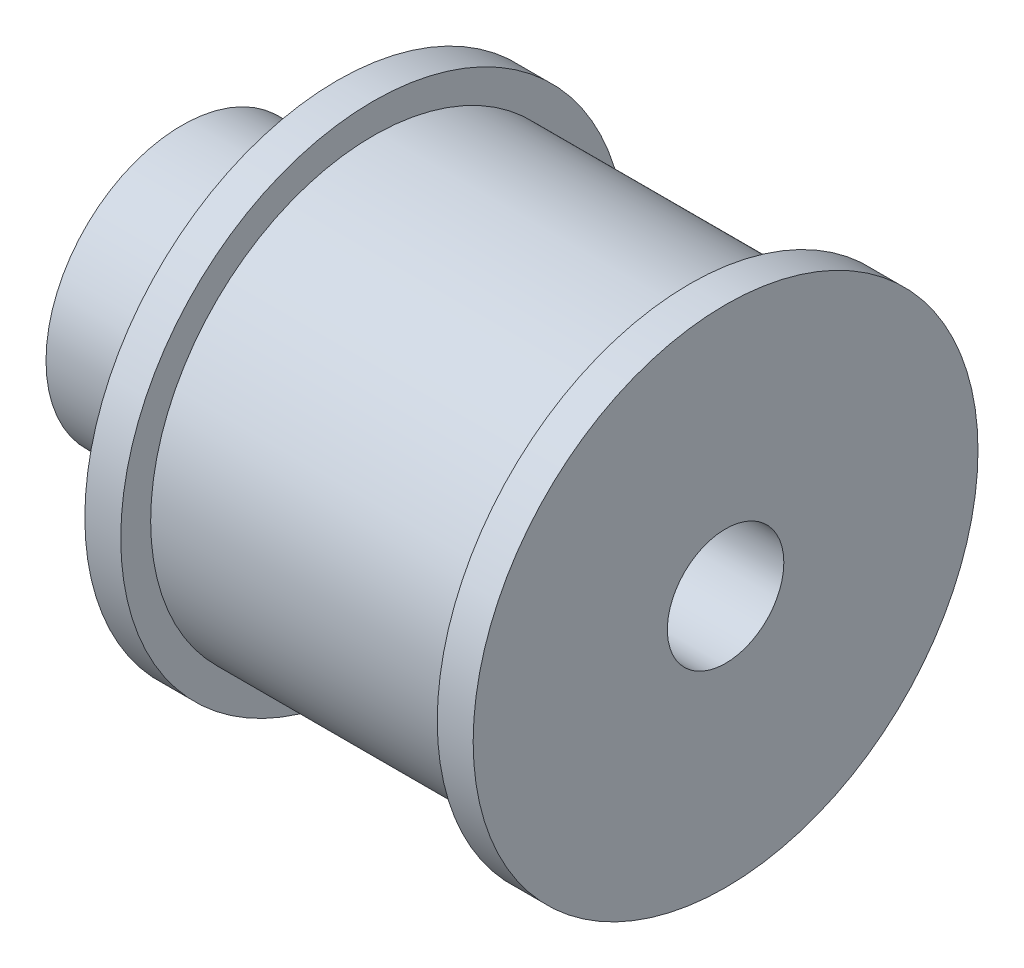
ISO-10303-21;
HEADER;
FILE_DESCRIPTION(('STEP AP214'),'2;1');
FILE_NAME('part.step','',(''),(''),'','','');
FILE_SCHEMA(('AUTOMOTIVE_DESIGN { 1 0 10303 214 1 1 1 1 }'));
ENDSEC;
DATA;
#1=APPLICATION_CONTEXT('core data for automotive mechanical design processes');
#2=APPLICATION_PROTOCOL_DEFINITION('international standard','automotive_design',2000,#1);
#3=PRODUCT_CONTEXT('',#1,'mechanical');
#4=PRODUCT('Part','Part','',(#3));
#5=PRODUCT_RELATED_PRODUCT_CATEGORY('part','',(#4));
#6=PRODUCT_DEFINITION_FORMATION('','',#4);
#7=PRODUCT_DEFINITION_CONTEXT('part definition',#1,'design');
#8=PRODUCT_DEFINITION('design','',#6,#7);
#9=PRODUCT_DEFINITION_SHAPE('','',#8);
#10=(LENGTH_UNIT() NAMED_UNIT(*) SI_UNIT(.MILLI.,.METRE.));
#11=(NAMED_UNIT(*) PLANE_ANGLE_UNIT() SI_UNIT($,.RADIAN.));
#12=(NAMED_UNIT(*) SI_UNIT($,.STERADIAN.) SOLID_ANGLE_UNIT());
#13=UNCERTAINTY_MEASURE_WITH_UNIT(LENGTH_MEASURE(1.E-05),#10,'distance_accuracy_value','');
#14=(GEOMETRIC_REPRESENTATION_CONTEXT(3) GLOBAL_UNCERTAINTY_ASSIGNED_CONTEXT((#13)) GLOBAL_UNIT_ASSIGNED_CONTEXT((#10,
#11,#12)) REPRESENTATION_CONTEXT('',''));
#15=CARTESIAN_POINT('',(0.,0.,0.));
#16=DIRECTION('',(0.,0.,1.));
#17=DIRECTION('',(1.,0.,0.));
#18=AXIS2_PLACEMENT_3D('',#15,#16,#17);
#19=CARTESIAN_POINT('',(-8.14999999999999,0.,11.46));
#20=DIRECTION('',(1.,0.,0.));
#21=DIRECTION('',(0.,0.,-1.));
#22=AXIS2_PLACEMENT_3D('',#19,#20,#21);
#23=PLANE('',#22);
#24=CARTESIAN_POINT('',(-8.14999999999999,0.,0.));
#25=DIRECTION('',(-1.,0.,0.));
#26=DIRECTION('',(0.,0.,1.));
#27=AXIS2_PLACEMENT_3D('',#24,#25,#26);
#28=CIRCLE('',#27,11.46);
#29=CARTESIAN_POINT('',(-8.14999999999999,0.,11.46));
#30=VERTEX_POINT('',#29);
#31=EDGE_CURVE('E52',#30,#30,#28,.T.);
#32=ORIENTED_EDGE('',*,*,#31,.T.);
#33=EDGE_LOOP('',(#32));
#34=FACE_BOUND('',#33,.T.);
#35=CARTESIAN_POINT('',(-8.14999999999999,0.,0.));
#36=DIRECTION('',(-1.,0.,0.));
#37=DIRECTION('',(0.,0.,1.));
#38=AXIS2_PLACEMENT_3D('',#35,#36,#37);
#39=CIRCLE('',#38,13.);
#40=CARTESIAN_POINT('',(-8.14999999999999,0.,13.));
#41=VERTEX_POINT('',#40);
#42=EDGE_CURVE('E11',#41,#41,#39,.T.);
#43=ORIENTED_EDGE('',*,*,#42,.F.);
#44=EDGE_LOOP('',(#43));
#45=FACE_BOUND('',#44,.T.);
#46=ADVANCED_FACE('F33',(#34,#45),#23,.T.);
#47=CARTESIAN_POINT('',(-10.,0.,0.));
#48=DIRECTION('',(-1.,0.,0.));
#49=DIRECTION('',(0.,0.,1.));
#50=AXIS2_PLACEMENT_3D('',#47,#48,#49);
#51=CYLINDRICAL_SURFACE('',#50,13.);
#52=ORIENTED_EDGE('',*,*,#42,.T.);
#53=EDGE_LOOP('',(#52));
#54=FACE_BOUND('',#53,.T.);
#55=CARTESIAN_POINT('',(-9.99999999999999,0.,0.));
#56=DIRECTION('',(-1.,0.,0.));
#57=DIRECTION('',(0.,0.,1.));
#58=AXIS2_PLACEMENT_3D('',#55,#56,#57);
#59=CIRCLE('',#58,13.);
#60=CARTESIAN_POINT('',(-9.99999999999999,0.,13.));
#61=VERTEX_POINT('',#60);
#62=EDGE_CURVE('E39',#61,#61,#59,.T.);
#63=ORIENTED_EDGE('',*,*,#62,.F.);
#64=EDGE_LOOP('',(#63));
#65=FACE_BOUND('',#64,.T.);
#66=ADVANCED_FACE('F80',(#54,#65),#51,.T.);
#67=CARTESIAN_POINT('',(-9.99999999999999,0.,13.));
#68=DIRECTION('',(-1.,0.,0.));
#69=DIRECTION('',(0.,0.,1.));
#70=AXIS2_PLACEMENT_3D('',#67,#68,#69);
#71=PLANE('',#70);
#72=ORIENTED_EDGE('',*,*,#62,.T.);
#73=EDGE_LOOP('',(#72));
#74=FACE_BOUND('',#73,.T.);
#75=CARTESIAN_POINT('',(-9.99999999999999,0.,0.));
#76=DIRECTION('',(-1.,0.,0.));
#77=DIRECTION('',(0.,0.,1.));
#78=AXIS2_PLACEMENT_3D('',#75,#76,#77);
#79=CIRCLE('',#78,7.);
#80=CARTESIAN_POINT('',(-9.99999999999999,0.,7.));
#81=VERTEX_POINT('',#80);
#82=EDGE_CURVE('E72',#81,#81,#79,.T.);
#83=ORIENTED_EDGE('',*,*,#82,.F.);
#84=EDGE_LOOP('',(#83));
#85=FACE_BOUND('',#84,.T.);
#86=ADVANCED_FACE('F77',(#74,#85),#71,.T.);
#87=CARTESIAN_POINT('',(-10.,0.,0.));
#88=DIRECTION('',(-1.,0.,0.));
#89=DIRECTION('',(0.,0.,1.));
#90=AXIS2_PLACEMENT_3D('',#87,#88,#89);
#91=CYLINDRICAL_SURFACE('',#90,7.);
#92=ORIENTED_EDGE('',*,*,#82,.T.);
#93=EDGE_LOOP('',(#92));
#94=FACE_BOUND('',#93,.T.);
#95=CARTESIAN_POINT('',(-18.,0.,0.));
#96=DIRECTION('',(-1.,0.,0.));
#97=DIRECTION('',(0.,0.,1.));
#98=AXIS2_PLACEMENT_3D('',#95,#96,#97);
#99=CIRCLE('',#98,7.);
#100=CARTESIAN_POINT('',(-18.,0.,7.));
#101=VERTEX_POINT('',#100);
#102=EDGE_CURVE('E69',#101,#101,#99,.T.);
#103=ORIENTED_EDGE('',*,*,#102,.F.);
#104=EDGE_LOOP('',(#103));
#105=FACE_BOUND('',#104,.T.);
#106=ADVANCED_FACE('F87',(#94,#105),#91,.T.);
#107=CARTESIAN_POINT('',(-18.,0.,0.));
#108=DIRECTION('',(-1.,0.,0.));
#109=DIRECTION('',(0.,0.,1.));
#110=AXIS2_PLACEMENT_3D('',#107,#108,#109);
#111=PLANE('',#110);
#112=ORIENTED_EDGE('',*,*,#102,.T.);
#113=EDGE_LOOP('',(#112));
#114=FACE_BOUND('',#113,.T.);
#115=ADVANCED_FACE('F93',(#114),#111,.T.);
#116=CARTESIAN_POINT('',(10.,0.,0.));
#117=DIRECTION('',(1.,0.,0.));
#118=DIRECTION('',(0.,0.,-1.));
#119=AXIS2_PLACEMENT_3D('',#116,#117,#118);
#120=PLANE('',#119);
#121=CARTESIAN_POINT('',(10.,0.,0.));
#122=DIRECTION('',(1.,0.,0.));
#123=DIRECTION('',(0.,0.,-1.));
#124=AXIS2_PLACEMENT_3D('',#121,#122,#123);
#125=CIRCLE('',#124,2.99999999999999);
#126=CARTESIAN_POINT('',(10.,0.,-2.99999999999999));
#127=VERTEX_POINT('',#126);
#128=EDGE_CURVE('E53',#127,#127,#125,.T.);
#129=ORIENTED_EDGE('',*,*,#128,.F.);
#130=EDGE_LOOP('',(#129));
#131=FACE_BOUND('',#130,.T.);
#132=CARTESIAN_POINT('',(10.,0.,0.));
#133=DIRECTION('',(-1.,0.,0.));
#134=DIRECTION('',(0.,0.,1.));
#135=AXIS2_PLACEMENT_3D('',#132,#133,#134);
#136=CIRCLE('',#135,13.);
#137=CARTESIAN_POINT('',(10.,0.,13.));
#138=VERTEX_POINT('',#137);
#139=EDGE_CURVE('E66',#138,#138,#136,.T.);
#140=ORIENTED_EDGE('',*,*,#139,.F.);
#141=EDGE_LOOP('',(#140));
#142=FACE_BOUND('',#141,.T.);
#143=ADVANCED_FACE('F97',(#131,#142),#120,.T.);
#144=CARTESIAN_POINT('',(-10.,0.,0.));
#145=DIRECTION('',(-1.,0.,0.));
#146=DIRECTION('',(0.,0.,1.));
#147=AXIS2_PLACEMENT_3D('',#144,#145,#146);
#148=CYLINDRICAL_SURFACE('',#147,13.);
#149=ORIENTED_EDGE('',*,*,#139,.T.);
#150=EDGE_LOOP('',(#149));
#151=FACE_BOUND('',#150,.T.);
#152=CARTESIAN_POINT('',(8.15,0.,0.));
#153=DIRECTION('',(-1.,0.,0.));
#154=DIRECTION('',(0.,0.,1.));
#155=AXIS2_PLACEMENT_3D('',#152,#153,#154);
#156=CIRCLE('',#155,13.);
#157=CARTESIAN_POINT('',(8.15,0.,13.));
#158=VERTEX_POINT('',#157);
#159=EDGE_CURVE('E63',#158,#158,#156,.T.);
#160=ORIENTED_EDGE('',*,*,#159,.F.);
#161=EDGE_LOOP('',(#160));
#162=FACE_BOUND('',#161,.T.);
#163=ADVANCED_FACE('F101',(#151,#162),#148,.T.);
#164=CARTESIAN_POINT('',(8.15,0.,13.));
#165=DIRECTION('',(-1.,0.,0.));
#166=DIRECTION('',(0.,0.,1.));
#167=AXIS2_PLACEMENT_3D('',#164,#165,#166);
#168=PLANE('',#167);
#169=ORIENTED_EDGE('',*,*,#159,.T.);
#170=EDGE_LOOP('',(#169));
#171=FACE_BOUND('',#170,.T.);
#172=CARTESIAN_POINT('',(8.15,0.,0.));
#173=DIRECTION('',(-1.,0.,0.));
#174=DIRECTION('',(0.,0.,1.));
#175=AXIS2_PLACEMENT_3D('',#172,#173,#174);
#176=CIRCLE('',#175,11.46);
#177=CARTESIAN_POINT('',(8.15,0.,11.46));
#178=VERTEX_POINT('',#177);
#179=EDGE_CURVE('E56',#178,#178,#176,.T.);
#180=ORIENTED_EDGE('',*,*,#179,.F.);
#181=EDGE_LOOP('',(#180));
#182=FACE_BOUND('',#181,.T.);
#183=ADVANCED_FACE('F105',(#171,#182),#168,.T.);
#184=CARTESIAN_POINT('',(-10.,0.,0.));
#185=DIRECTION('',(-1.,0.,0.));
#186=DIRECTION('',(0.,0.,1.));
#187=AXIS2_PLACEMENT_3D('',#184,#185,#186);
#188=CYLINDRICAL_SURFACE('',#187,11.46);
#189=ORIENTED_EDGE('',*,*,#179,.T.);
#190=EDGE_LOOP('',(#189));
#191=FACE_BOUND('',#190,.T.);
#192=ORIENTED_EDGE('',*,*,#31,.F.);
#193=EDGE_LOOP('',(#192));
#194=FACE_BOUND('',#193,.T.);
#195=ADVANCED_FACE('F46',(#191,#194),#188,.T.);
#196=CARTESIAN_POINT('',(-14.,0.,0.));
#197=DIRECTION('',(1.,0.,0.));
#198=DIRECTION('',(0.,0.,-1.));
#199=AXIS2_PLACEMENT_3D('',#196,#197,#198);
#200=CONICAL_SURFACE('',#199,2.99999999999999,1.02974425867665);
#201=CARTESIAN_POINT('',(-15.8025818570827,0.,0.));
#202=VERTEX_POINT('',#201);
#203=VERTEX_LOOP('',#202);
#204=FACE_BOUND('',#203,.T.);
#205=CARTESIAN_POINT('',(-14.,0.,0.));
#206=DIRECTION('',(1.,0.,0.));
#207=DIRECTION('',(0.,0.,-1.));
#208=AXIS2_PLACEMENT_3D('',#205,#206,#207);
#209=CIRCLE('',#208,2.99999999999999);
#210=CARTESIAN_POINT('',(-14.,0.,-2.99999999999999));
#211=VERTEX_POINT('',#210);
#212=EDGE_CURVE('E50',#211,#211,#209,.T.);
#213=ORIENTED_EDGE('',*,*,#212,.T.);
#214=EDGE_LOOP('',(#213));
#215=FACE_BOUND('',#214,.T.);
#216=ADVANCED_FACE('F42',(#204,#215),#200,.F.);
#217=CARTESIAN_POINT('',(10.,0.,0.));
#218=DIRECTION('',(1.,0.,0.));
#219=DIRECTION('',(0.,0.,-1.));
#220=AXIS2_PLACEMENT_3D('',#217,#218,#219);
#221=CYLINDRICAL_SURFACE('',#220,2.99999999999999);
#222=ORIENTED_EDGE('',*,*,#212,.F.);
#223=EDGE_LOOP('',(#222));
#224=FACE_BOUND('',#223,.T.);
#225=ORIENTED_EDGE('',*,*,#128,.T.);
#226=EDGE_LOOP('',(#225));
#227=FACE_BOUND('',#226,.T.);
#228=ADVANCED_FACE('F45',(#224,#227),#221,.F.);
#229=CLOSED_SHELL('',(#46,#66,#86,#106,#115,#143,#163,#183,#195,#216,#228));
#230=MANIFOLD_SOLID_BREP('B2',#229);
#231=ADVANCED_BREP_SHAPE_REPRESENTATION('',(#18,#230),#14);
#232=SHAPE_DEFINITION_REPRESENTATION(#9,#231);
ENDSEC;
END-ISO-10303-21;
